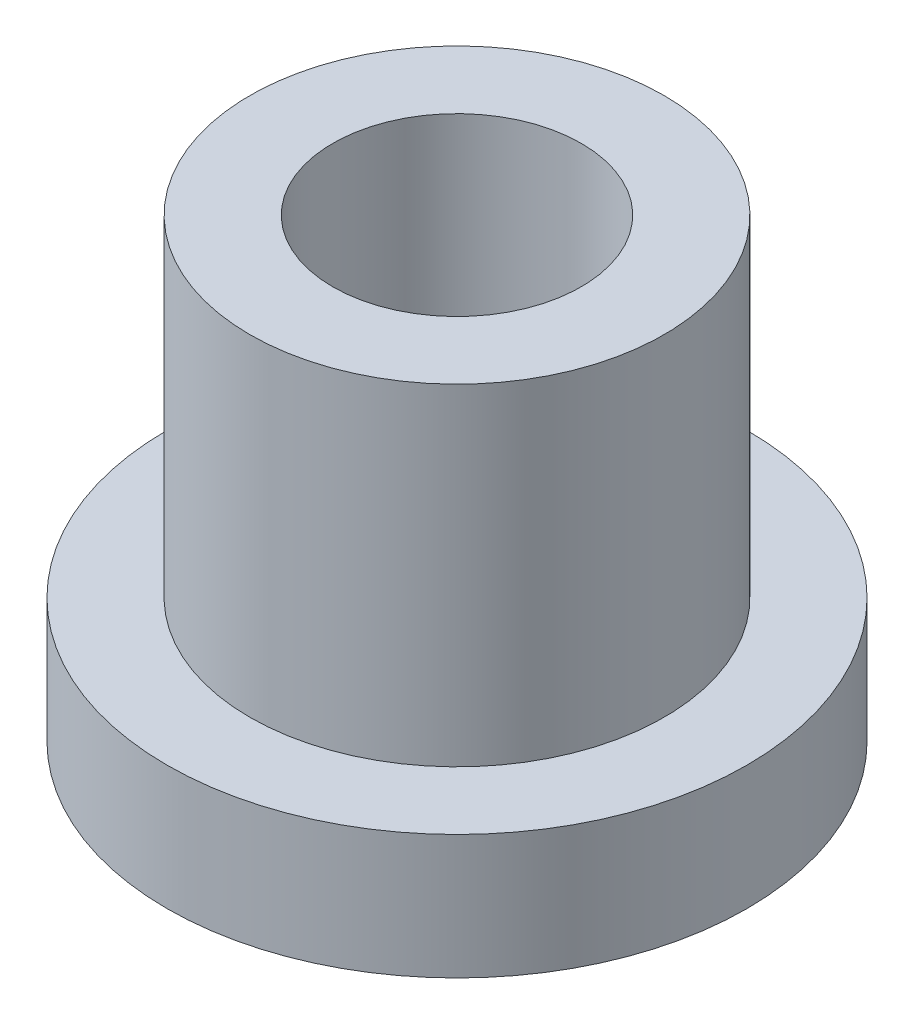
ISO-10303-21;
HEADER;
FILE_DESCRIPTION(('STEP AP214'),'2;1');
FILE_NAME('part.step','',(''),(''),'','','');
FILE_SCHEMA(('AUTOMOTIVE_DESIGN { 1 0 10303 214 1 1 1 1 }'));
ENDSEC;
DATA;
#1=APPLICATION_CONTEXT('core data for automotive mechanical design processes');
#2=APPLICATION_PROTOCOL_DEFINITION('international standard','automotive_design',2000,#1);
#3=PRODUCT_CONTEXT('',#1,'mechanical');
#4=PRODUCT('Part','Part','',(#3));
#5=PRODUCT_RELATED_PRODUCT_CATEGORY('part','',(#4));
#6=PRODUCT_DEFINITION_FORMATION('','',#4);
#7=PRODUCT_DEFINITION_CONTEXT('part definition',#1,'design');
#8=PRODUCT_DEFINITION('design','',#6,#7);
#9=PRODUCT_DEFINITION_SHAPE('','',#8);
#10=(LENGTH_UNIT() NAMED_UNIT(*) SI_UNIT(.MILLI.,.METRE.));
#11=(NAMED_UNIT(*) PLANE_ANGLE_UNIT() SI_UNIT($,.RADIAN.));
#12=(NAMED_UNIT(*) SI_UNIT($,.STERADIAN.) SOLID_ANGLE_UNIT());
#13=UNCERTAINTY_MEASURE_WITH_UNIT(LENGTH_MEASURE(1.E-05),#10,'distance_accuracy_value','');
#14=(GEOMETRIC_REPRESENTATION_CONTEXT(3) GLOBAL_UNCERTAINTY_ASSIGNED_CONTEXT((#13)) GLOBAL_UNIT_ASSIGNED_CONTEXT((#10,
#11,#12)) REPRESENTATION_CONTEXT('',''));
#15=CARTESIAN_POINT('',(0.,0.,0.));
#16=DIRECTION('',(0.,0.,1.));
#17=DIRECTION('',(1.,0.,0.));
#18=AXIS2_PLACEMENT_3D('',#15,#16,#17);
#19=CARTESIAN_POINT('',(0.,3.,0.));
#20=DIRECTION('',(0.,1.,0.));
#21=DIRECTION('',(0.,0.,1.));
#22=AXIS2_PLACEMENT_3D('',#19,#20,#21);
#23=PLANE('',#22);
#24=CARTESIAN_POINT('',(0.,3.,0.));
#25=DIRECTION('',(0.,1.,0.));
#26=DIRECTION('',(0.,0.,1.));
#27=AXIS2_PLACEMENT_3D('',#24,#25,#26);
#28=CIRCLE('',#27,7.);
#29=CARTESIAN_POINT('',(0.,3.,7.));
#30=VERTEX_POINT('',#29);
#31=EDGE_CURVE('E10',#30,#30,#28,.T.);
#32=ORIENTED_EDGE('',*,*,#31,.T.);
#33=EDGE_LOOP('',(#32));
#34=FACE_BOUND('',#33,.T.);
#35=CARTESIAN_POINT('',(0.,3.,0.));
#36=DIRECTION('',(0.,1.,0.));
#37=DIRECTION('',(0.,0.,1.));
#38=AXIS2_PLACEMENT_3D('',#35,#36,#37);
#39=CIRCLE('',#38,5.);
#40=CARTESIAN_POINT('',(0.,3.,5.));
#41=VERTEX_POINT('',#40);
#42=EDGE_CURVE('E53',#41,#41,#39,.T.);
#43=ORIENTED_EDGE('',*,*,#42,.F.);
#44=EDGE_LOOP('',(#43));
#45=FACE_BOUND('',#44,.T.);
#46=ADVANCED_FACE('F37',(#34,#45),#23,.T.);
#47=CARTESIAN_POINT('',(0.,0.,0.));
#48=DIRECTION('',(0.,1.,0.));
#49=DIRECTION('',(0.,0.,1.));
#50=AXIS2_PLACEMENT_3D('',#47,#48,#49);
#51=PLANE('',#50);
#52=CARTESIAN_POINT('',(0.,0.,0.));
#53=DIRECTION('',(0.,1.,0.));
#54=DIRECTION('',(0.,0.,1.));
#55=AXIS2_PLACEMENT_3D('',#52,#53,#54);
#56=CIRCLE('',#55,7.);
#57=CARTESIAN_POINT('',(0.,0.,7.));
#58=VERTEX_POINT('',#57);
#59=EDGE_CURVE('E41',#58,#58,#56,.T.);
#60=ORIENTED_EDGE('',*,*,#59,.F.);
#61=EDGE_LOOP('',(#60));
#62=FACE_BOUND('',#61,.T.);
#63=CARTESIAN_POINT('',(0.,0.,0.));
#64=DIRECTION('',(0.,1.,0.));
#65=DIRECTION('',(0.,0.,1.));
#66=AXIS2_PLACEMENT_3D('',#63,#64,#65);
#67=CIRCLE('',#66,3.);
#68=CARTESIAN_POINT('',(0.,0.,3.));
#69=VERTEX_POINT('',#68);
#70=EDGE_CURVE('E48',#69,#69,#67,.T.);
#71=ORIENTED_EDGE('',*,*,#70,.T.);
#72=EDGE_LOOP('',(#71));
#73=FACE_BOUND('',#72,.T.);
#74=ADVANCED_FACE('F78',(#62,#73),#51,.F.);
#75=CARTESIAN_POINT('',(0.,3.,0.));
#76=DIRECTION('',(0.,-1.,0.));
#77=DIRECTION('',(0.,0.,-1.));
#78=AXIS2_PLACEMENT_3D('',#75,#76,#77);
#79=CYLINDRICAL_SURFACE('',#78,7.);
#80=ORIENTED_EDGE('',*,*,#31,.F.);
#81=EDGE_LOOP('',(#80));
#82=FACE_BOUND('',#81,.T.);
#83=ORIENTED_EDGE('',*,*,#59,.T.);
#84=EDGE_LOOP('',(#83));
#85=FACE_BOUND('',#84,.T.);
#86=ADVANCED_FACE('F39',(#82,#85),#79,.T.);
#87=CARTESIAN_POINT('',(0.,3.,0.));
#88=DIRECTION('',(0.,-1.,0.));
#89=DIRECTION('',(0.,0.,-1.));
#90=AXIS2_PLACEMENT_3D('',#87,#88,#89);
#91=CYLINDRICAL_SURFACE('',#90,3.);
#92=ORIENTED_EDGE('',*,*,#70,.F.);
#93=EDGE_LOOP('',(#92));
#94=FACE_BOUND('',#93,.T.);
#95=CARTESIAN_POINT('',(0.,11.,0.));
#96=DIRECTION('',(0.,1.,0.));
#97=DIRECTION('',(0.,0.,1.));
#98=AXIS2_PLACEMENT_3D('',#95,#96,#97);
#99=CIRCLE('',#98,3.);
#100=CARTESIAN_POINT('',(0.,11.,3.));
#101=VERTEX_POINT('',#100);
#102=EDGE_CURVE('E56',#101,#101,#99,.T.);
#103=ORIENTED_EDGE('',*,*,#102,.T.);
#104=EDGE_LOOP('',(#103));
#105=FACE_BOUND('',#104,.T.);
#106=ADVANCED_FACE('F62',(#94,#105),#91,.F.);
#107=CARTESIAN_POINT('',(0.,11.,0.));
#108=DIRECTION('',(0.,1.,0.));
#109=DIRECTION('',(0.,0.,1.));
#110=AXIS2_PLACEMENT_3D('',#107,#108,#109);
#111=PLANE('',#110);
#112=CARTESIAN_POINT('',(0.,11.,0.));
#113=DIRECTION('',(0.,1.,0.));
#114=DIRECTION('',(0.,0.,1.));
#115=AXIS2_PLACEMENT_3D('',#112,#113,#114);
#116=CIRCLE('',#115,5.);
#117=CARTESIAN_POINT('',(0.,11.,5.));
#118=VERTEX_POINT('',#117);
#119=EDGE_CURVE('E52',#118,#118,#116,.T.);
#120=ORIENTED_EDGE('',*,*,#119,.T.);
#121=EDGE_LOOP('',(#120));
#122=FACE_BOUND('',#121,.T.);
#123=ORIENTED_EDGE('',*,*,#102,.F.);
#124=EDGE_LOOP('',(#123));
#125=FACE_BOUND('',#124,.T.);
#126=ADVANCED_FACE('F64',(#122,#125),#111,.T.);
#127=CARTESIAN_POINT('',(0.,11.,0.));
#128=DIRECTION('',(0.,-1.,0.));
#129=DIRECTION('',(0.,0.,-1.));
#130=AXIS2_PLACEMENT_3D('',#127,#128,#129);
#131=CYLINDRICAL_SURFACE('',#130,5.);
#132=ORIENTED_EDGE('',*,*,#119,.F.);
#133=EDGE_LOOP('',(#132));
#134=FACE_BOUND('',#133,.T.);
#135=ORIENTED_EDGE('',*,*,#42,.T.);
#136=EDGE_LOOP('',(#135));
#137=FACE_BOUND('',#136,.T.);
#138=ADVANCED_FACE('F66',(#134,#137),#131,.T.);
#139=CLOSED_SHELL('',(#46,#74,#86,#106,#126,#138));
#140=MANIFOLD_SOLID_BREP('B2',#139);
#141=ADVANCED_BREP_SHAPE_REPRESENTATION('',(#18,#140),#14);
#142=SHAPE_DEFINITION_REPRESENTATION(#9,#141);
ENDSEC;
END-ISO-10303-21;
